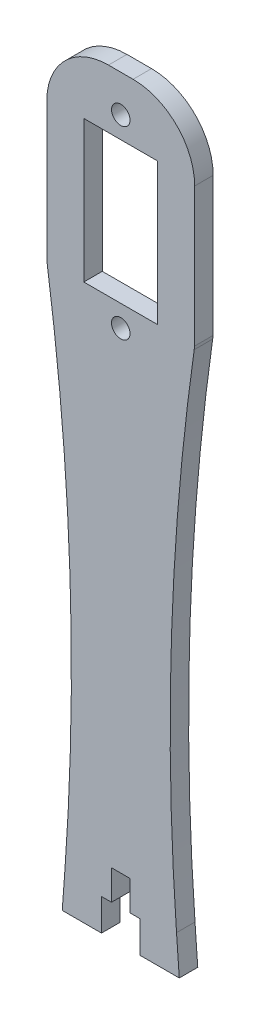
ISO-10303-21;
HEADER;
FILE_DESCRIPTION(('STEP AP214'),'2;1');
FILE_NAME('part.step','',(''),(''),'','','');
FILE_SCHEMA(('AUTOMOTIVE_DESIGN { 1 0 10303 214 1 1 1 1 }'));
ENDSEC;
DATA;
#1=APPLICATION_CONTEXT('core data for automotive mechanical design processes');
#2=APPLICATION_PROTOCOL_DEFINITION('international standard','automotive_design',2000,#1);
#3=PRODUCT_CONTEXT('',#1,'mechanical');
#4=PRODUCT('Part','Part','',(#3));
#5=PRODUCT_RELATED_PRODUCT_CATEGORY('part','',(#4));
#6=PRODUCT_DEFINITION_FORMATION('','',#4);
#7=PRODUCT_DEFINITION_CONTEXT('part definition',#1,'design');
#8=PRODUCT_DEFINITION('design','',#6,#7);
#9=PRODUCT_DEFINITION_SHAPE('','',#8);
#10=(LENGTH_UNIT() NAMED_UNIT(*) SI_UNIT(.MILLI.,.METRE.));
#11=(NAMED_UNIT(*) PLANE_ANGLE_UNIT() SI_UNIT($,.RADIAN.));
#12=(NAMED_UNIT(*) SI_UNIT($,.STERADIAN.) SOLID_ANGLE_UNIT());
#13=UNCERTAINTY_MEASURE_WITH_UNIT(LENGTH_MEASURE(1.E-05),#10,'distance_accuracy_value','');
#14=(GEOMETRIC_REPRESENTATION_CONTEXT(3) GLOBAL_UNCERTAINTY_ASSIGNED_CONTEXT((#13)) GLOBAL_UNIT_ASSIGNED_CONTEXT((#10,
#11,#12)) REPRESENTATION_CONTEXT('',''));
#15=CARTESIAN_POINT('',(0.,0.,0.));
#16=DIRECTION('',(0.,0.,1.));
#17=DIRECTION('',(1.,0.,0.));
#18=AXIS2_PLACEMENT_3D('',#15,#16,#17);
#19=CARTESIAN_POINT('',(-398.018777082135,-90.5861853265082,3.));
#20=DIRECTION('',(0.,0.,1.));
#21=DIRECTION('',(1.,0.,0.));
#22=AXIS2_PLACEMENT_3D('',#19,#20,#21);
#23=PLANE('',#22);
#24=CARTESIAN_POINT('',(0.,-8.49999999999963,3.));
#25=DIRECTION('',(0.,0.,1.));
#26=DIRECTION('',(-1.,0.,0.));
#27=AXIS2_PLACEMENT_3D('',#24,#25,#26);
#28=CIRCLE('',#27,1.50000000000003);
#29=CARTESIAN_POINT('',(-1.49999999999993,-8.49999999999963,3.));
#30=VERTEX_POINT('',#29);
#31=EDGE_CURVE('E237',#30,#30,#28,.T.);
#32=ORIENTED_EDGE('',*,*,#31,.F.);
#33=EDGE_LOOP('',(#32));
#34=FACE_BOUND('',#33,.T.);
#35=DIRECTION('',(1.,0.,0.));
#36=VECTOR('',#35,1.);
#37=CARTESIAN_POINT('',(9.49999999996186,-125.100000000001,3.));
#38=LINE('',#37,#36);
#39=CARTESIAN_POINT('',(3.12499999999931,-125.100000000001,3.));
#40=VERTEX_POINT('',#39);
#41=CARTESIAN_POINT('',(9.49999999996186,-125.100000000001,3.));
#42=VERTEX_POINT('',#41);
#43=EDGE_CURVE('E243',#40,#42,#38,.T.);
#44=ORIENTED_EDGE('',*,*,#43,.T.);
#45=DIRECTION('',(-0.0727235930969796,0.997352133906107,0.));
#46=VECTOR('',#45,1.);
#47=CARTESIAN_POINT('',(9.49999999996186,-125.100000000001,3.));
#48=LINE('',#47,#46);
#49=CARTESIAN_POINT('',(9.05144485887893,-118.948386636549,3.));
#50=VERTEX_POINT('',#49);
#51=EDGE_CURVE('E246',#42,#50,#48,.T.);
#52=ORIENTED_EDGE('',*,*,#51,.T.);
#53=CARTESIAN_POINT('',(398.01877708226,-90.586185328721,3.));
#54=DIRECTION('',(0.,0.,-1.));
#55=DIRECTION('',(-1.,0.,0.));
#56=AXIS2_PLACEMENT_3D('',#53,#54,#55);
#57=CIRCLE('',#56,390.);
#58=CARTESIAN_POINT('',(11.9201538813167,-35.5602536025256,3.));
#59=VERTEX_POINT('',#58);
#60=EDGE_CURVE('E249',#50,#59,#57,.T.);
#61=ORIENTED_EDGE('',*,*,#60,.T.);
#62=DIRECTION('',(0.141092132605903,0.989996469749624,0.));
#63=VECTOR('',#62,1.);
#64=CARTESIAN_POINT('',(11.9999999999611,-34.9999999999952,3.));
#65=LINE('',#64,#63);
#66=CARTESIAN_POINT('',(11.9999999999611,-34.9999999999952,3.));
#67=VERTEX_POINT('',#66);
#68=EDGE_CURVE('E251',#59,#67,#65,.T.);
#69=ORIENTED_EDGE('',*,*,#68,.T.);
#70=DIRECTION('',(6.48478184731022E-13,1.,0.));
#71=VECTOR('',#70,1.);
#72=CARTESIAN_POINT('',(11.9999999999611,-34.9999999999952,3.));
#73=LINE('',#72,#71);
#74=CARTESIAN_POINT('',(11.9999999999757,-12.5000000000061,3.));
#75=VERTEX_POINT('',#74);
#76=EDGE_CURVE('E253',#67,#75,#73,.T.);
#77=ORIENTED_EDGE('',*,*,#76,.T.);
#78=CARTESIAN_POINT('',(1.99999999997573,-12.4999999999996,3.));
#79=DIRECTION('',(0.,0.,1.));
#80=DIRECTION('',(1.,0.,0.));
#81=AXIS2_PLACEMENT_3D('',#78,#79,#80);
#82=CIRCLE('',#81,9.99999999999997);
#83=CARTESIAN_POINT('',(1.99999999997566,-2.4999999999996,3.));
#84=VERTEX_POINT('',#83);
#85=EDGE_CURVE('E255',#75,#84,#82,.T.);
#86=ORIENTED_EDGE('',*,*,#85,.T.);
#87=DIRECTION('',(-1.,0.,0.));
#88=VECTOR('',#87,1.);
#89=CARTESIAN_POINT('',(0.,-2.4999999999996,3.));
#90=LINE('',#89,#88);
#91=CARTESIAN_POINT('',(-2.00000000000433,-2.4999999999996,3.));
#92=VERTEX_POINT('',#91);
#93=EDGE_CURVE('E257',#84,#92,#90,.T.);
#94=ORIENTED_EDGE('',*,*,#93,.T.);
#95=CARTESIAN_POINT('',(-2.0000000000044,-12.4999999999996,3.));
#96=DIRECTION('',(0.,0.,1.));
#97=DIRECTION('',(-1.,0.,0.));
#98=AXIS2_PLACEMENT_3D('',#95,#96,#97);
#99=CIRCLE('',#98,9.99999999999997);
#100=CARTESIAN_POINT('',(-12.0000000000044,-12.5000000000015,3.));
#101=VERTEX_POINT('',#100);
#102=EDGE_CURVE('E259',#92,#101,#99,.T.);
#103=ORIENTED_EDGE('',*,*,#102,.T.);
#104=DIRECTION('',(1.88506617722831E-13,-1.,0.));
#105=VECTOR('',#104,1.);
#106=CARTESIAN_POINT('',(-12.0000000000001,-34.9999999999993,3.));
#107=LINE('',#106,#105);
#108=CARTESIAN_POINT('',(-12.0000000000001,-34.9999999999993,3.));
#109=VERTEX_POINT('',#108);
#110=EDGE_CURVE('E261',#101,#109,#107,.T.);
#111=ORIENTED_EDGE('',*,*,#110,.T.);
#112=DIRECTION('',(0.141092133438911,-0.989996469630905,0.));
#113=VECTOR('',#112,1.);
#114=CARTESIAN_POINT('',(-12.0000000000001,-34.9999999999993,3.));
#115=LINE('',#114,#113);
#116=CARTESIAN_POINT('',(-11.9201539260924,-35.5602532852561,3.));
#117=VERTEX_POINT('',#116);
#118=EDGE_CURVE('E263',#109,#117,#115,.T.);
#119=ORIENTED_EDGE('',*,*,#118,.T.);
#120=CARTESIAN_POINT('',(-398.018777082135,-90.5861853265082,3.));
#121=DIRECTION('',(0.,0.,-1.));
#122=DIRECTION('',(1.,0.,0.));
#123=AXIS2_PLACEMENT_3D('',#120,#121,#122);
#124=CIRCLE('',#123,390.000000000001);
#125=CARTESIAN_POINT('',(-9.05144485876297,-118.948386634463,3.));
#126=VERTEX_POINT('',#125);
#127=EDGE_CURVE('E265',#117,#126,#124,.T.);
#128=ORIENTED_EDGE('',*,*,#127,.T.);
#129=DIRECTION('',(-0.0727235930973346,-0.997352133906081,0.));
#130=VECTOR('',#129,1.);
#131=CARTESIAN_POINT('',(-9.50000000000011,-125.1,3.));
#132=LINE('',#131,#130);
#133=CARTESIAN_POINT('',(-9.50000000000011,-125.1,3.));
#134=VERTEX_POINT('',#133);
#135=EDGE_CURVE('E267',#126,#134,#132,.T.);
#136=ORIENTED_EDGE('',*,*,#135,.T.);
#137=DIRECTION('',(1.,-1.21906841919636E-13,0.));
#138=VECTOR('',#137,1.);
#139=CARTESIAN_POINT('',(-3.12500000000069,-125.100000000001,3.));
#140=LINE('',#139,#138);
#141=CARTESIAN_POINT('',(-3.12500000000069,-125.100000000001,3.));
#142=VERTEX_POINT('',#141);
#143=EDGE_CURVE('E269',#134,#142,#140,.T.);
#144=ORIENTED_EDGE('',*,*,#143,.T.);
#145=DIRECTION('',(0.,1.,0.));
#146=VECTOR('',#145,1.);
#147=CARTESIAN_POINT('',(-3.12500000000069,-119.95,3.));
#148=LINE('',#147,#146);
#149=CARTESIAN_POINT('',(-3.12500000000069,-119.95,3.));
#150=VERTEX_POINT('',#149);
#151=EDGE_CURVE('E271',#142,#150,#148,.T.);
#152=ORIENTED_EDGE('',*,*,#151,.T.);
#153=DIRECTION('',(1.,0.,0.));
#154=VECTOR('',#153,1.);
#155=CARTESIAN_POINT('',(-1.50000000003821,-119.95,3.));
#156=LINE('',#155,#154);
#157=CARTESIAN_POINT('',(-1.50000000003821,-119.95,3.));
#158=VERTEX_POINT('',#157);
#159=EDGE_CURVE('E273',#150,#158,#156,.T.);
#160=ORIENTED_EDGE('',*,*,#159,.T.);
#161=DIRECTION('',(0.,1.,0.));
#162=VECTOR('',#161,1.);
#163=CARTESIAN_POINT('',(-1.50000000003821,-119.95,3.));
#164=LINE('',#163,#162);
#165=CARTESIAN_POINT('',(-1.50000000003821,-115.099999999995,3.));
#166=VERTEX_POINT('',#165);
#167=EDGE_CURVE('E275',#158,#166,#164,.T.);
#168=ORIENTED_EDGE('',*,*,#167,.T.);
#169=DIRECTION('',(1.,0.,0.));
#170=VECTOR('',#169,1.);
#171=CARTESIAN_POINT('',(-1.50000000003821,-115.099999999995,3.));
#172=LINE('',#171,#170);
#173=CARTESIAN_POINT('',(1.49999999996179,-115.099999999995,3.));
#174=VERTEX_POINT('',#173);
#175=EDGE_CURVE('E277',#166,#174,#172,.T.);
#176=ORIENTED_EDGE('',*,*,#175,.T.);
#177=DIRECTION('',(0.,-1.,0.));
#178=VECTOR('',#177,1.);
#179=CARTESIAN_POINT('',(1.49999999996179,-115.099999999995,3.));
#180=LINE('',#179,#178);
#181=CARTESIAN_POINT('',(1.49999999996179,-119.95,3.));
#182=VERTEX_POINT('',#181);
#183=EDGE_CURVE('E279',#174,#182,#180,.T.);
#184=ORIENTED_EDGE('',*,*,#183,.T.);
#185=DIRECTION('',(1.,0.,0.));
#186=VECTOR('',#185,1.);
#187=CARTESIAN_POINT('',(3.12499999999931,-119.95,3.));
#188=LINE('',#187,#186);
#189=CARTESIAN_POINT('',(3.12499999999931,-119.95,3.));
#190=VERTEX_POINT('',#189);
#191=EDGE_CURVE('E281',#182,#190,#188,.T.);
#192=ORIENTED_EDGE('',*,*,#191,.T.);
#193=DIRECTION('',(0.,-1.,0.));
#194=VECTOR('',#193,1.);
#195=CARTESIAN_POINT('',(3.12499999999931,-119.95,3.));
#196=LINE('',#195,#194);
#197=EDGE_CURVE('E283',#190,#40,#196,.T.);
#198=ORIENTED_EDGE('',*,*,#197,.T.);
#199=EDGE_LOOP('',(#44,#52,#61,#69,#77,#86,#94,#103,#111,#119,#128,#136,#144,#152,#160,#168,
#176,#184,#192,#198));
#200=FACE_BOUND('',#199,.T.);
#201=CARTESIAN_POINT('',(-6.93889390390723E-13,-38.4998710234909,3.));
#202=DIRECTION('',(0.,0.,1.));
#203=DIRECTION('',(-1.,0.,0.));
#204=AXIS2_PLACEMENT_3D('',#201,#202,#203);
#205=CIRCLE('',#204,1.50000000000001);
#206=CARTESIAN_POINT('',(-1.50000000000071,-38.4998710234909,3.));
#207=VERTEX_POINT('',#206);
#208=EDGE_CURVE('E231',#207,#207,#205,.T.);
#209=ORIENTED_EDGE('',*,*,#208,.F.);
#210=EDGE_LOOP('',(#209));
#211=FACE_BOUND('',#210,.T.);
#212=DIRECTION('',(0.,1.,0.));
#213=VECTOR('',#212,1.);
#214=CARTESIAN_POINT('',(5.99999999999739,-34.9999999999995,3.));
#215=LINE('',#214,#213);
#216=CARTESIAN_POINT('',(5.99999999999739,-34.9999999999995,3.));
#217=VERTEX_POINT('',#216);
#218=CARTESIAN_POINT('',(5.99999999999739,-11.9999999999995,3.));
#219=VERTEX_POINT('',#218);
#220=EDGE_CURVE('E213',#217,#219,#215,.T.);
#221=ORIENTED_EDGE('',*,*,#220,.F.);
#222=DIRECTION('',(1.,0.,0.));
#223=VECTOR('',#222,1.);
#224=CARTESIAN_POINT('',(-5.99999999999739,-34.9999999999995,3.));
#225=LINE('',#224,#223);
#226=CARTESIAN_POINT('',(-5.99999999999739,-34.9999999999995,3.));
#227=VERTEX_POINT('',#226);
#228=EDGE_CURVE('E200',#227,#217,#225,.T.);
#229=ORIENTED_EDGE('',*,*,#228,.F.);
#230=DIRECTION('',(0.,-1.,0.));
#231=VECTOR('',#230,1.);
#232=CARTESIAN_POINT('',(-5.99999999999739,-23.4999999999995,3.));
#233=LINE('',#232,#231);
#234=CARTESIAN_POINT('',(-5.99999999999743,-11.9999999999995,3.));
#235=VERTEX_POINT('',#234);
#236=EDGE_CURVE('E195',#235,#227,#233,.T.);
#237=ORIENTED_EDGE('',*,*,#236,.F.);
#238=DIRECTION('',(-1.,0.,0.));
#239=VECTOR('',#238,1.);
#240=CARTESIAN_POINT('',(5.99999999999739,-11.9999999999995,3.));
#241=LINE('',#240,#239);
#242=EDGE_CURVE('E215',#219,#235,#241,.T.);
#243=ORIENTED_EDGE('',*,*,#242,.F.);
#244=EDGE_LOOP('',(#221,#229,#237,#243));
#245=FACE_BOUND('',#244,.T.);
#246=ADVANCED_FACE('F37',(#34,#200,#211,#245),#23,.T.);
#247=CARTESIAN_POINT('',(-398.018777082135,-90.5861853265082,0.));
#248=DIRECTION('',(0.,0.,1.));
#249=DIRECTION('',(1.,0.,0.));
#250=AXIS2_PLACEMENT_3D('',#247,#248,#249);
#251=PLANE('',#250);
#252=CARTESIAN_POINT('',(-6.93889390390723E-13,-38.4998710234909,0.));
#253=DIRECTION('',(0.,0.,1.));
#254=DIRECTION('',(-1.,0.,0.));
#255=AXIS2_PLACEMENT_3D('',#252,#253,#254);
#256=CIRCLE('',#255,1.50000000000001);
#257=CARTESIAN_POINT('',(-1.50000000000071,-38.4998710234909,0.));
#258=VERTEX_POINT('',#257);
#259=EDGE_CURVE('E209',#258,#258,#256,.T.);
#260=ORIENTED_EDGE('',*,*,#259,.T.);
#261=EDGE_LOOP('',(#260));
#262=FACE_BOUND('',#261,.T.);
#263=CARTESIAN_POINT('',(0.,-8.49999999999963,0.));
#264=DIRECTION('',(0.,0.,1.));
#265=DIRECTION('',(-1.,0.,0.));
#266=AXIS2_PLACEMENT_3D('',#263,#264,#265);
#267=CIRCLE('',#266,1.50000000000003);
#268=CARTESIAN_POINT('',(-1.49999999999993,-8.49999999999963,0.));
#269=VERTEX_POINT('',#268);
#270=EDGE_CURVE('E234',#269,#269,#267,.T.);
#271=ORIENTED_EDGE('',*,*,#270,.T.);
#272=EDGE_LOOP('',(#271));
#273=FACE_BOUND('',#272,.T.);
#274=DIRECTION('',(1.,0.,0.));
#275=VECTOR('',#274,1.);
#276=CARTESIAN_POINT('',(9.49999999996186,-125.100000000001,0.));
#277=LINE('',#276,#275);
#278=CARTESIAN_POINT('',(3.12499999999931,-125.100000000001,0.));
#279=VERTEX_POINT('',#278);
#280=CARTESIAN_POINT('',(9.49999999996186,-125.100000000001,0.));
#281=VERTEX_POINT('',#280);
#282=EDGE_CURVE('E240',#279,#281,#277,.T.);
#283=ORIENTED_EDGE('',*,*,#282,.F.);
#284=DIRECTION('',(0.,-1.,0.));
#285=VECTOR('',#284,1.);
#286=CARTESIAN_POINT('',(3.12499999999931,-119.95,0.));
#287=LINE('',#286,#285);
#288=CARTESIAN_POINT('',(3.12499999999931,-119.95,0.));
#289=VERTEX_POINT('',#288);
#290=EDGE_CURVE('E247',#289,#279,#287,.T.);
#291=ORIENTED_EDGE('',*,*,#290,.F.);
#292=DIRECTION('',(1.,0.,0.));
#293=VECTOR('',#292,1.);
#294=CARTESIAN_POINT('',(3.12499999999931,-119.95,0.));
#295=LINE('',#294,#293);
#296=CARTESIAN_POINT('',(1.49999999996179,-119.95,0.));
#297=VERTEX_POINT('',#296);
#298=EDGE_CURVE('E323',#297,#289,#295,.T.);
#299=ORIENTED_EDGE('',*,*,#298,.F.);
#300=DIRECTION('',(0.,-1.,0.));
#301=VECTOR('',#300,1.);
#302=CARTESIAN_POINT('',(1.49999999996179,-115.099999999995,0.));
#303=LINE('',#302,#301);
#304=CARTESIAN_POINT('',(1.49999999996179,-115.099999999995,0.));
#305=VERTEX_POINT('',#304);
#306=EDGE_CURVE('E321',#305,#297,#303,.T.);
#307=ORIENTED_EDGE('',*,*,#306,.F.);
#308=DIRECTION('',(1.,0.,0.));
#309=VECTOR('',#308,1.);
#310=CARTESIAN_POINT('',(-1.50000000003821,-115.099999999995,0.));
#311=LINE('',#310,#309);
#312=CARTESIAN_POINT('',(-1.50000000003821,-115.099999999995,0.));
#313=VERTEX_POINT('',#312);
#314=EDGE_CURVE('E319',#313,#305,#311,.T.);
#315=ORIENTED_EDGE('',*,*,#314,.F.);
#316=DIRECTION('',(0.,1.,0.));
#317=VECTOR('',#316,1.);
#318=CARTESIAN_POINT('',(-1.50000000003821,-119.95,0.));
#319=LINE('',#318,#317);
#320=CARTESIAN_POINT('',(-1.50000000003821,-119.95,0.));
#321=VERTEX_POINT('',#320);
#322=EDGE_CURVE('E317',#321,#313,#319,.T.);
#323=ORIENTED_EDGE('',*,*,#322,.F.);
#324=DIRECTION('',(1.,0.,0.));
#325=VECTOR('',#324,1.);
#326=CARTESIAN_POINT('',(-1.50000000003821,-119.95,0.));
#327=LINE('',#326,#325);
#328=CARTESIAN_POINT('',(-3.12500000000069,-119.95,0.));
#329=VERTEX_POINT('',#328);
#330=EDGE_CURVE('E315',#329,#321,#327,.T.);
#331=ORIENTED_EDGE('',*,*,#330,.F.);
#332=DIRECTION('',(0.,1.,0.));
#333=VECTOR('',#332,1.);
#334=CARTESIAN_POINT('',(-3.12500000000069,-119.95,0.));
#335=LINE('',#334,#333);
#336=CARTESIAN_POINT('',(-3.12500000000069,-125.100000000001,0.));
#337=VERTEX_POINT('',#336);
#338=EDGE_CURVE('E313',#337,#329,#335,.T.);
#339=ORIENTED_EDGE('',*,*,#338,.F.);
#340=DIRECTION('',(1.,-1.21906841919636E-13,0.));
#341=VECTOR('',#340,1.);
#342=CARTESIAN_POINT('',(-3.12500000000069,-125.100000000001,0.));
#343=LINE('',#342,#341);
#344=CARTESIAN_POINT('',(-9.50000000000011,-125.1,0.));
#345=VERTEX_POINT('',#344);
#346=EDGE_CURVE('E311',#345,#337,#343,.T.);
#347=ORIENTED_EDGE('',*,*,#346,.F.);
#348=DIRECTION('',(-0.0727235930973346,-0.997352133906081,0.));
#349=VECTOR('',#348,1.);
#350=CARTESIAN_POINT('',(-9.50000000000011,-125.1,0.));
#351=LINE('',#350,#349);
#352=CARTESIAN_POINT('',(-9.05144485876297,-118.948386634463,0.));
#353=VERTEX_POINT('',#352);
#354=EDGE_CURVE('E309',#353,#345,#351,.T.);
#355=ORIENTED_EDGE('',*,*,#354,.F.);
#356=CARTESIAN_POINT('',(-398.018777082135,-90.5861853265082,0.));
#357=DIRECTION('',(0.,0.,-1.));
#358=DIRECTION('',(1.,0.,0.));
#359=AXIS2_PLACEMENT_3D('',#356,#357,#358);
#360=CIRCLE('',#359,390.000000000001);
#361=CARTESIAN_POINT('',(-11.9201539260924,-35.5602532852561,0.));
#362=VERTEX_POINT('',#361);
#363=EDGE_CURVE('E307',#362,#353,#360,.T.);
#364=ORIENTED_EDGE('',*,*,#363,.F.);
#365=DIRECTION('',(0.141092133438911,-0.989996469630905,0.));
#366=VECTOR('',#365,1.);
#367=CARTESIAN_POINT('',(-12.0000000000001,-34.9999999999993,0.));
#368=LINE('',#367,#366);
#369=CARTESIAN_POINT('',(-12.0000000000001,-34.9999999999993,0.));
#370=VERTEX_POINT('',#369);
#371=EDGE_CURVE('E305',#370,#362,#368,.T.);
#372=ORIENTED_EDGE('',*,*,#371,.F.);
#373=DIRECTION('',(1.88506617722831E-13,-1.,0.));
#374=VECTOR('',#373,1.);
#375=CARTESIAN_POINT('',(-12.0000000000001,-34.9999999999993,0.));
#376=LINE('',#375,#374);
#377=CARTESIAN_POINT('',(-12.0000000000044,-12.5000000000015,0.));
#378=VERTEX_POINT('',#377);
#379=EDGE_CURVE('E303',#378,#370,#376,.T.);
#380=ORIENTED_EDGE('',*,*,#379,.F.);
#381=CARTESIAN_POINT('',(-2.0000000000044,-12.4999999999996,0.));
#382=DIRECTION('',(0.,0.,1.));
#383=DIRECTION('',(-1.,0.,0.));
#384=AXIS2_PLACEMENT_3D('',#381,#382,#383);
#385=CIRCLE('',#384,9.99999999999997);
#386=CARTESIAN_POINT('',(-2.00000000000433,-2.4999999999996,0.));
#387=VERTEX_POINT('',#386);
#388=EDGE_CURVE('E301',#387,#378,#385,.T.);
#389=ORIENTED_EDGE('',*,*,#388,.F.);
#390=DIRECTION('',(-1.,0.,0.));
#391=VECTOR('',#390,1.);
#392=CARTESIAN_POINT('',(-2.00000000000434,-2.4999999999996,0.));
#393=LINE('',#392,#391);
#394=CARTESIAN_POINT('',(1.99999999997566,-2.4999999999996,0.));
#395=VERTEX_POINT('',#394);
#396=EDGE_CURVE('E299',#395,#387,#393,.T.);
#397=ORIENTED_EDGE('',*,*,#396,.F.);
#398=CARTESIAN_POINT('',(1.99999999997573,-12.4999999999996,0.));
#399=DIRECTION('',(0.,0.,1.));
#400=DIRECTION('',(1.,0.,0.));
#401=AXIS2_PLACEMENT_3D('',#398,#399,#400);
#402=CIRCLE('',#401,9.99999999999997);
#403=CARTESIAN_POINT('',(11.9999999999757,-12.5000000000061,0.));
#404=VERTEX_POINT('',#403);
#405=EDGE_CURVE('E296',#404,#395,#402,.T.);
#406=ORIENTED_EDGE('',*,*,#405,.F.);
#407=DIRECTION('',(6.48478184731022E-13,1.,0.));
#408=VECTOR('',#407,1.);
#409=CARTESIAN_POINT('',(11.9999999999611,-34.9999999999952,0.));
#410=LINE('',#409,#408);
#411=CARTESIAN_POINT('',(11.9999999999611,-34.9999999999952,0.));
#412=VERTEX_POINT('',#411);
#413=EDGE_CURVE('E294',#412,#404,#410,.T.);
#414=ORIENTED_EDGE('',*,*,#413,.F.);
#415=DIRECTION('',(0.141092132605903,0.989996469749624,0.));
#416=VECTOR('',#415,1.);
#417=CARTESIAN_POINT('',(11.9999999999611,-34.9999999999952,0.));
#418=LINE('',#417,#416);
#419=CARTESIAN_POINT('',(11.9201538813167,-35.5602536025256,0.));
#420=VERTEX_POINT('',#419);
#421=EDGE_CURVE('E292',#420,#412,#418,.T.);
#422=ORIENTED_EDGE('',*,*,#421,.F.);
#423=CARTESIAN_POINT('',(398.01877708226,-90.586185328721,0.));
#424=DIRECTION('',(0.,0.,-1.));
#425=DIRECTION('',(-1.,0.,0.));
#426=AXIS2_PLACEMENT_3D('',#423,#424,#425);
#427=CIRCLE('',#426,390.);
#428=CARTESIAN_POINT('',(9.05144485887893,-118.948386636549,0.));
#429=VERTEX_POINT('',#428);
#430=EDGE_CURVE('E290',#429,#420,#427,.T.);
#431=ORIENTED_EDGE('',*,*,#430,.F.);
#432=DIRECTION('',(-0.0727235930969796,0.997352133906107,0.));
#433=VECTOR('',#432,1.);
#434=CARTESIAN_POINT('',(9.49999999996186,-125.100000000001,0.));
#435=LINE('',#434,#433);
#436=EDGE_CURVE('E288',#281,#429,#435,.T.);
#437=ORIENTED_EDGE('',*,*,#436,.F.);
#438=EDGE_LOOP('',(#283,#291,#299,#307,#315,#323,#331,#339,#347,#355,#364,#372,#380,#389,#397,
#406,#414,#422,#431,#437));
#439=FACE_BOUND('',#438,.T.);
#440=DIRECTION('',(1.,0.,0.));
#441=VECTOR('',#440,1.);
#442=CARTESIAN_POINT('',(5.99999999999739,-34.9999999999995,0.));
#443=LINE('',#442,#441);
#444=CARTESIAN_POINT('',(-5.99999999999742,-34.9999999999995,0.));
#445=VERTEX_POINT('',#444);
#446=CARTESIAN_POINT('',(5.99999999999739,-34.9999999999995,0.));
#447=VERTEX_POINT('',#446);
#448=EDGE_CURVE('E207',#445,#447,#443,.T.);
#449=ORIENTED_EDGE('',*,*,#448,.T.);
#450=DIRECTION('',(0.,1.,0.));
#451=VECTOR('',#450,1.);
#452=CARTESIAN_POINT('',(5.99999999999739,-34.9999999999995,0.));
#453=LINE('',#452,#451);
#454=CARTESIAN_POINT('',(5.99999999999739,-11.9999999999995,0.));
#455=VERTEX_POINT('',#454);
#456=EDGE_CURVE('E220',#447,#455,#453,.T.);
#457=ORIENTED_EDGE('',*,*,#456,.T.);
#458=DIRECTION('',(-1.,0.,0.));
#459=VECTOR('',#458,1.);
#460=CARTESIAN_POINT('',(5.99999999999739,-11.9999999999995,0.));
#461=LINE('',#460,#459);
#462=CARTESIAN_POINT('',(-5.9999999999974,-11.9999999999995,0.));
#463=VERTEX_POINT('',#462);
#464=EDGE_CURVE('E223',#455,#463,#461,.T.);
#465=ORIENTED_EDGE('',*,*,#464,.T.);
#466=DIRECTION('',(0.,-1.,0.));
#467=VECTOR('',#466,1.);
#468=CARTESIAN_POINT('',(-5.99999999999739,-23.4999999999995,0.));
#469=LINE('',#468,#467);
#470=EDGE_CURVE('E201',#463,#445,#469,.T.);
#471=ORIENTED_EDGE('',*,*,#470,.T.);
#472=EDGE_LOOP('',(#449,#457,#465,#471));
#473=FACE_BOUND('',#472,.T.);
#474=ADVANCED_FACE('F389',(#262,#273,#439,#473),#251,.F.);
#475=CARTESIAN_POINT('',(9.49999999996186,-125.100000000001,3.));
#476=DIRECTION('',(0.,1.,0.));
#477=DIRECTION('',(0.,0.,1.));
#478=AXIS2_PLACEMENT_3D('',#475,#476,#477);
#479=PLANE('',#478);
#480=ORIENTED_EDGE('',*,*,#282,.T.);
#481=DIRECTION('',(0.,0.,-1.));
#482=VECTOR('',#481,1.);
#483=CARTESIAN_POINT('',(9.49999999996186,-125.100000000001,3.));
#484=LINE('',#483,#482);
#485=EDGE_CURVE('E11',#42,#281,#484,.T.);
#486=ORIENTED_EDGE('',*,*,#485,.F.);
#487=ORIENTED_EDGE('',*,*,#43,.F.);
#488=DIRECTION('',(0.,0.,-1.));
#489=VECTOR('',#488,1.);
#490=CARTESIAN_POINT('',(3.12499999999931,-125.100000000001,3.));
#491=LINE('',#490,#489);
#492=EDGE_CURVE('E285',#40,#279,#491,.T.);
#493=ORIENTED_EDGE('',*,*,#492,.T.);
#494=EDGE_LOOP('',(#480,#486,#487,#493));
#495=FACE_BOUND('',#494,.T.);
#496=ADVANCED_FACE('F39',(#495),#479,.F.);
#497=CARTESIAN_POINT('',(9.49999999996186,-125.100000000001,3.));
#498=DIRECTION('',(-0.997352133906107,-0.0727235930969796,0.));
#499=DIRECTION('',(0.0727235930969796,-0.997352133906107,0.));
#500=AXIS2_PLACEMENT_3D('',#497,#498,#499);
#501=PLANE('',#500);
#502=ORIENTED_EDGE('',*,*,#436,.T.);
#503=DIRECTION('',(0.,0.,-1.));
#504=VECTOR('',#503,1.);
#505=CARTESIAN_POINT('',(9.05144485887893,-118.948386636549,3.));
#506=LINE('',#505,#504);
#507=EDGE_CURVE('E45',#50,#429,#506,.T.);
#508=ORIENTED_EDGE('',*,*,#507,.F.);
#509=ORIENTED_EDGE('',*,*,#51,.F.);
#510=ORIENTED_EDGE('',*,*,#485,.T.);
#511=EDGE_LOOP('',(#502,#508,#509,#510));
#512=FACE_BOUND('',#511,.T.);
#513=ADVANCED_FACE('F407',(#512),#501,.F.);
#514=CARTESIAN_POINT('',(398.01877708226,-90.586185328721,3.));
#515=DIRECTION('',(0.,0.,-1.));
#516=DIRECTION('',(-1.,0.,0.));
#517=AXIS2_PLACEMENT_3D('',#514,#515,#516);
#518=CYLINDRICAL_SURFACE('',#517,390.);
#519=ORIENTED_EDGE('',*,*,#430,.T.);
#520=DIRECTION('',(0.,0.,-1.));
#521=VECTOR('',#520,1.);
#522=CARTESIAN_POINT('',(11.9201538813167,-35.5602536025256,3.));
#523=LINE('',#522,#521);
#524=EDGE_CURVE('E376',#59,#420,#523,.T.);
#525=ORIENTED_EDGE('',*,*,#524,.F.);
#526=ORIENTED_EDGE('',*,*,#60,.F.);
#527=ORIENTED_EDGE('',*,*,#507,.T.);
#528=EDGE_LOOP('',(#519,#525,#526,#527));
#529=FACE_BOUND('',#528,.T.);
#530=ADVANCED_FACE('F383',(#529),#518,.F.);
#531=CARTESIAN_POINT('',(11.9999999999611,-34.9999999999952,3.));
#532=DIRECTION('',(-0.989996469749624,0.141092132605903,0.));
#533=DIRECTION('',(-0.141092132605903,-0.989996469749624,0.));
#534=AXIS2_PLACEMENT_3D('',#531,#532,#533);
#535=PLANE('',#534);
#536=ORIENTED_EDGE('',*,*,#421,.T.);
#537=DIRECTION('',(0.,0.,-1.));
#538=VECTOR('',#537,1.);
#539=CARTESIAN_POINT('',(11.9999999999611,-34.9999999999952,3.));
#540=LINE('',#539,#538);
#541=EDGE_CURVE('E373',#67,#412,#540,.T.);
#542=ORIENTED_EDGE('',*,*,#541,.F.);
#543=ORIENTED_EDGE('',*,*,#68,.F.);
#544=ORIENTED_EDGE('',*,*,#524,.T.);
#545=EDGE_LOOP('',(#536,#542,#543,#544));
#546=FACE_BOUND('',#545,.T.);
#547=ADVANCED_FACE('F395',(#546),#535,.F.);
#548=CARTESIAN_POINT('',(11.9999999999611,-34.9999999999952,3.));
#549=DIRECTION('',(-1.,6.48478184731022E-13,0.));
#550=DIRECTION('',(-6.48478184731022E-13,-1.,0.));
#551=AXIS2_PLACEMENT_3D('',#548,#549,#550);
#552=PLANE('',#551);
#553=ORIENTED_EDGE('',*,*,#413,.T.);
#554=DIRECTION('',(0.,0.,-1.));
#555=VECTOR('',#554,1.);
#556=CARTESIAN_POINT('',(11.9999999999757,-12.5000000000061,3.));
#557=LINE('',#556,#555);
#558=EDGE_CURVE('E370',#75,#404,#557,.T.);
#559=ORIENTED_EDGE('',*,*,#558,.F.);
#560=ORIENTED_EDGE('',*,*,#76,.F.);
#561=ORIENTED_EDGE('',*,*,#541,.T.);
#562=EDGE_LOOP('',(#553,#559,#560,#561));
#563=FACE_BOUND('',#562,.T.);
#564=ADVANCED_FACE('F399',(#563),#552,.F.);
#565=CARTESIAN_POINT('',(1.99999999997573,-12.4999999999996,3.));
#566=DIRECTION('',(0.,0.,-1.));
#567=DIRECTION('',(-1.,0.,0.));
#568=AXIS2_PLACEMENT_3D('',#565,#566,#567);
#569=CYLINDRICAL_SURFACE('',#568,9.99999999999997);
#570=ORIENTED_EDGE('',*,*,#405,.T.);
#571=DIRECTION('',(0.,0.,-1.));
#572=VECTOR('',#571,1.);
#573=CARTESIAN_POINT('',(1.99999999997566,-2.4999999999996,3.));
#574=LINE('',#573,#572);
#575=EDGE_CURVE('E367',#84,#395,#574,.T.);
#576=ORIENTED_EDGE('',*,*,#575,.F.);
#577=ORIENTED_EDGE('',*,*,#85,.F.);
#578=ORIENTED_EDGE('',*,*,#558,.T.);
#579=EDGE_LOOP('',(#570,#576,#577,#578));
#580=FACE_BOUND('',#579,.T.);
#581=ADVANCED_FACE('F479',(#580),#569,.T.);
#582=CARTESIAN_POINT('',(-2.00000000000434,-2.4999999999996,3.));
#583=DIRECTION('',(0.,-1.,0.));
#584=DIRECTION('',(1.,0.,0.));
#585=AXIS2_PLACEMENT_3D('',#582,#583,#584);
#586=PLANE('',#585);
#587=ORIENTED_EDGE('',*,*,#396,.T.);
#588=DIRECTION('',(0.,0.,-1.));
#589=VECTOR('',#588,1.);
#590=CARTESIAN_POINT('',(-2.00000000000433,-2.4999999999996,3.));
#591=LINE('',#590,#589);
#592=EDGE_CURVE('E364',#92,#387,#591,.T.);
#593=ORIENTED_EDGE('',*,*,#592,.F.);
#594=ORIENTED_EDGE('',*,*,#93,.F.);
#595=ORIENTED_EDGE('',*,*,#575,.T.);
#596=EDGE_LOOP('',(#587,#593,#594,#595));
#597=FACE_BOUND('',#596,.T.);
#598=ADVANCED_FACE('F477',(#597),#586,.F.);
#599=CARTESIAN_POINT('',(-2.0000000000044,-12.4999999999996,3.));
#600=DIRECTION('',(0.,0.,-1.));
#601=DIRECTION('',(-1.,0.,0.));
#602=AXIS2_PLACEMENT_3D('',#599,#600,#601);
#603=CYLINDRICAL_SURFACE('',#602,9.99999999999997);
#604=ORIENTED_EDGE('',*,*,#388,.T.);
#605=DIRECTION('',(0.,0.,-1.));
#606=VECTOR('',#605,1.);
#607=CARTESIAN_POINT('',(-12.0000000000044,-12.5000000000015,3.));
#608=LINE('',#607,#606);
#609=EDGE_CURVE('E361',#101,#378,#608,.T.);
#610=ORIENTED_EDGE('',*,*,#609,.F.);
#611=ORIENTED_EDGE('',*,*,#102,.F.);
#612=ORIENTED_EDGE('',*,*,#592,.T.);
#613=EDGE_LOOP('',(#604,#610,#611,#612));
#614=FACE_BOUND('',#613,.T.);
#615=ADVANCED_FACE('F472',(#614),#603,.T.);
#616=CARTESIAN_POINT('',(-12.0000000000001,-34.9999999999993,3.));
#617=DIRECTION('',(1.,1.88506617722831E-13,0.));
#618=DIRECTION('',(-1.88506617722831E-13,1.,0.));
#619=AXIS2_PLACEMENT_3D('',#616,#617,#618);
#620=PLANE('',#619);
#621=ORIENTED_EDGE('',*,*,#379,.T.);
#622=DIRECTION('',(0.,0.,-1.));
#623=VECTOR('',#622,1.);
#624=CARTESIAN_POINT('',(-12.0000000000001,-34.9999999999993,3.));
#625=LINE('',#624,#623);
#626=EDGE_CURVE('E358',#109,#370,#625,.T.);
#627=ORIENTED_EDGE('',*,*,#626,.F.);
#628=ORIENTED_EDGE('',*,*,#110,.F.);
#629=ORIENTED_EDGE('',*,*,#609,.T.);
#630=EDGE_LOOP('',(#621,#627,#628,#629));
#631=FACE_BOUND('',#630,.T.);
#632=ADVANCED_FACE('F468',(#631),#620,.F.);
#633=CARTESIAN_POINT('',(-12.0000000000001,-34.9999999999993,3.));
#634=DIRECTION('',(0.989996469630905,0.141092133438911,0.));
#635=DIRECTION('',(-0.141092133438911,0.989996469630906,0.));
#636=AXIS2_PLACEMENT_3D('',#633,#634,#635);
#637=PLANE('',#636);
#638=ORIENTED_EDGE('',*,*,#371,.T.);
#639=DIRECTION('',(0.,0.,-1.));
#640=VECTOR('',#639,1.);
#641=CARTESIAN_POINT('',(-11.9201539260924,-35.5602532852561,3.));
#642=LINE('',#641,#640);
#643=EDGE_CURVE('E355',#117,#362,#642,.T.);
#644=ORIENTED_EDGE('',*,*,#643,.F.);
#645=ORIENTED_EDGE('',*,*,#118,.F.);
#646=ORIENTED_EDGE('',*,*,#626,.T.);
#647=EDGE_LOOP('',(#638,#644,#645,#646));
#648=FACE_BOUND('',#647,.T.);
#649=ADVANCED_FACE('F464',(#648),#637,.F.);
#650=CARTESIAN_POINT('',(-398.018777082135,-90.5861853265082,3.));
#651=DIRECTION('',(0.,0.,-1.));
#652=DIRECTION('',(-1.,0.,0.));
#653=AXIS2_PLACEMENT_3D('',#650,#651,#652);
#654=CYLINDRICAL_SURFACE('',#653,390.000000000001);
#655=ORIENTED_EDGE('',*,*,#363,.T.);
#656=DIRECTION('',(0.,0.,-1.));
#657=VECTOR('',#656,1.);
#658=CARTESIAN_POINT('',(-9.05144485876297,-118.948386634463,3.));
#659=LINE('',#658,#657);
#660=EDGE_CURVE('E352',#126,#353,#659,.T.);
#661=ORIENTED_EDGE('',*,*,#660,.F.);
#662=ORIENTED_EDGE('',*,*,#127,.F.);
#663=ORIENTED_EDGE('',*,*,#643,.T.);
#664=EDGE_LOOP('',(#655,#661,#662,#663));
#665=FACE_BOUND('',#664,.T.);
#666=ADVANCED_FACE('F459',(#665),#654,.F.);
#667=CARTESIAN_POINT('',(-9.50000000000011,-125.1,3.));
#668=DIRECTION('',(0.997352133906081,-0.0727235930973346,0.));
#669=DIRECTION('',(0.0727235930973346,0.997352133906081,0.));
#670=AXIS2_PLACEMENT_3D('',#667,#668,#669);
#671=PLANE('',#670);
#672=ORIENTED_EDGE('',*,*,#354,.T.);
#673=DIRECTION('',(0.,0.,-1.));
#674=VECTOR('',#673,1.);
#675=CARTESIAN_POINT('',(-9.50000000000011,-125.1,3.));
#676=LINE('',#675,#674);
#677=EDGE_CURVE('E349',#134,#345,#676,.T.);
#678=ORIENTED_EDGE('',*,*,#677,.F.);
#679=ORIENTED_EDGE('',*,*,#135,.F.);
#680=ORIENTED_EDGE('',*,*,#660,.T.);
#681=EDGE_LOOP('',(#672,#678,#679,#680));
#682=FACE_BOUND('',#681,.T.);
#683=ADVANCED_FACE('F453',(#682),#671,.F.);
#684=CARTESIAN_POINT('',(-3.12500000000069,-125.100000000001,3.));
#685=DIRECTION('',(1.21906841919636E-13,1.,0.));
#686=DIRECTION('',(-1.,1.21906841919636E-13,0.));
#687=AXIS2_PLACEMENT_3D('',#684,#685,#686);
#688=PLANE('',#687);
#689=ORIENTED_EDGE('',*,*,#346,.T.);
#690=DIRECTION('',(0.,0.,-1.));
#691=VECTOR('',#690,1.);
#692=CARTESIAN_POINT('',(-3.12500000000069,-125.100000000001,3.));
#693=LINE('',#692,#691);
#694=EDGE_CURVE('E346',#142,#337,#693,.T.);
#695=ORIENTED_EDGE('',*,*,#694,.F.);
#696=ORIENTED_EDGE('',*,*,#143,.F.);
#697=ORIENTED_EDGE('',*,*,#677,.T.);
#698=EDGE_LOOP('',(#689,#695,#696,#697));
#699=FACE_BOUND('',#698,.T.);
#700=ADVANCED_FACE('F449',(#699),#688,.F.);
#701=CARTESIAN_POINT('',(-3.12500000000069,-119.95,3.));
#702=DIRECTION('',(-1.,0.,0.));
#703=DIRECTION('',(0.,0.,1.));
#704=AXIS2_PLACEMENT_3D('',#701,#702,#703);
#705=PLANE('',#704);
#706=ORIENTED_EDGE('',*,*,#338,.T.);
#707=DIRECTION('',(0.,0.,-1.));
#708=VECTOR('',#707,1.);
#709=CARTESIAN_POINT('',(-3.12500000000069,-119.95,3.));
#710=LINE('',#709,#708);
#711=EDGE_CURVE('E343',#150,#329,#710,.T.);
#712=ORIENTED_EDGE('',*,*,#711,.F.);
#713=ORIENTED_EDGE('',*,*,#151,.F.);
#714=ORIENTED_EDGE('',*,*,#694,.T.);
#715=EDGE_LOOP('',(#706,#712,#713,#714));
#716=FACE_BOUND('',#715,.T.);
#717=ADVANCED_FACE('F444',(#716),#705,.F.);
#718=CARTESIAN_POINT('',(-1.50000000003821,-119.95,3.));
#719=DIRECTION('',(0.,1.,0.));
#720=DIRECTION('',(0.,0.,1.));
#721=AXIS2_PLACEMENT_3D('',#718,#719,#720);
#722=PLANE('',#721);
#723=ORIENTED_EDGE('',*,*,#330,.T.);
#724=DIRECTION('',(0.,0.,-1.));
#725=VECTOR('',#724,1.);
#726=CARTESIAN_POINT('',(-1.50000000003821,-119.95,3.));
#727=LINE('',#726,#725);
#728=EDGE_CURVE('E340',#158,#321,#727,.T.);
#729=ORIENTED_EDGE('',*,*,#728,.F.);
#730=ORIENTED_EDGE('',*,*,#159,.F.);
#731=ORIENTED_EDGE('',*,*,#711,.T.);
#732=EDGE_LOOP('',(#723,#729,#730,#731));
#733=FACE_BOUND('',#732,.T.);
#734=ADVANCED_FACE('F438',(#733),#722,.F.);
#735=CARTESIAN_POINT('',(-1.50000000003821,-119.95,3.));
#736=DIRECTION('',(-1.,0.,0.));
#737=DIRECTION('',(0.,-1.,0.));
#738=AXIS2_PLACEMENT_3D('',#735,#736,#737);
#739=PLANE('',#738);
#740=ORIENTED_EDGE('',*,*,#322,.T.);
#741=DIRECTION('',(0.,0.,-1.));
#742=VECTOR('',#741,1.);
#743=CARTESIAN_POINT('',(-1.50000000003821,-115.099999999995,3.));
#744=LINE('',#743,#742);
#745=EDGE_CURVE('E337',#166,#313,#744,.T.);
#746=ORIENTED_EDGE('',*,*,#745,.F.);
#747=ORIENTED_EDGE('',*,*,#167,.F.);
#748=ORIENTED_EDGE('',*,*,#728,.T.);
#749=EDGE_LOOP('',(#740,#746,#747,#748));
#750=FACE_BOUND('',#749,.T.);
#751=ADVANCED_FACE('F434',(#750),#739,.F.);
#752=CARTESIAN_POINT('',(-1.50000000003821,-115.099999999995,3.));
#753=DIRECTION('',(0.,1.,0.));
#754=DIRECTION('',(0.,0.,1.));
#755=AXIS2_PLACEMENT_3D('',#752,#753,#754);
#756=PLANE('',#755);
#757=ORIENTED_EDGE('',*,*,#314,.T.);
#758=DIRECTION('',(0.,0.,-1.));
#759=VECTOR('',#758,1.);
#760=CARTESIAN_POINT('',(1.49999999996179,-115.099999999995,3.));
#761=LINE('',#760,#759);
#762=EDGE_CURVE('E334',#174,#305,#761,.T.);
#763=ORIENTED_EDGE('',*,*,#762,.F.);
#764=ORIENTED_EDGE('',*,*,#175,.F.);
#765=ORIENTED_EDGE('',*,*,#745,.T.);
#766=EDGE_LOOP('',(#757,#763,#764,#765));
#767=FACE_BOUND('',#766,.T.);
#768=ADVANCED_FACE('F429',(#767),#756,.F.);
#769=CARTESIAN_POINT('',(1.49999999996179,-115.099999999995,3.));
#770=DIRECTION('',(1.,0.,0.));
#771=DIRECTION('',(0.,1.,0.));
#772=AXIS2_PLACEMENT_3D('',#769,#770,#771);
#773=PLANE('',#772);
#774=ORIENTED_EDGE('',*,*,#306,.T.);
#775=DIRECTION('',(0.,0.,-1.));
#776=VECTOR('',#775,1.);
#777=CARTESIAN_POINT('',(1.49999999996179,-119.95,3.));
#778=LINE('',#777,#776);
#779=EDGE_CURVE('E331',#182,#297,#778,.T.);
#780=ORIENTED_EDGE('',*,*,#779,.F.);
#781=ORIENTED_EDGE('',*,*,#183,.F.);
#782=ORIENTED_EDGE('',*,*,#762,.T.);
#783=EDGE_LOOP('',(#774,#780,#781,#782));
#784=FACE_BOUND('',#783,.T.);
#785=ADVANCED_FACE('F423',(#784),#773,.F.);
#786=CARTESIAN_POINT('',(3.12499999999931,-119.95,3.));
#787=DIRECTION('',(0.,1.,0.));
#788=DIRECTION('',(0.,0.,1.));
#789=AXIS2_PLACEMENT_3D('',#786,#787,#788);
#790=PLANE('',#789);
#791=ORIENTED_EDGE('',*,*,#298,.T.);
#792=DIRECTION('',(0.,0.,-1.));
#793=VECTOR('',#792,1.);
#794=CARTESIAN_POINT('',(3.12499999999931,-119.95,3.));
#795=LINE('',#794,#793);
#796=EDGE_CURVE('E328',#190,#289,#795,.T.);
#797=ORIENTED_EDGE('',*,*,#796,.F.);
#798=ORIENTED_EDGE('',*,*,#191,.F.);
#799=ORIENTED_EDGE('',*,*,#779,.T.);
#800=EDGE_LOOP('',(#791,#797,#798,#799));
#801=FACE_BOUND('',#800,.T.);
#802=ADVANCED_FACE('F419',(#801),#790,.F.);
#803=CARTESIAN_POINT('',(3.12499999999931,-119.95,3.));
#804=DIRECTION('',(1.,0.,0.));
#805=DIRECTION('',(0.,0.,-1.));
#806=AXIS2_PLACEMENT_3D('',#803,#804,#805);
#807=PLANE('',#806);
#808=ORIENTED_EDGE('',*,*,#290,.T.);
#809=ORIENTED_EDGE('',*,*,#492,.F.);
#810=ORIENTED_EDGE('',*,*,#197,.F.);
#811=ORIENTED_EDGE('',*,*,#796,.T.);
#812=EDGE_LOOP('',(#808,#809,#810,#811));
#813=FACE_BOUND('',#812,.T.);
#814=ADVANCED_FACE('F414',(#813),#807,.F.);
#815=CARTESIAN_POINT('',(0.,-8.49999999999963,3.));
#816=DIRECTION('',(0.,0.,-1.));
#817=DIRECTION('',(-1.,0.,0.));
#818=AXIS2_PLACEMENT_3D('',#815,#816,#817);
#819=CYLINDRICAL_SURFACE('',#818,1.50000000000003);
#820=ORIENTED_EDGE('',*,*,#31,.T.);
#821=EDGE_LOOP('',(#820));
#822=FACE_BOUND('',#821,.T.);
#823=ORIENTED_EDGE('',*,*,#270,.F.);
#824=EDGE_LOOP('',(#823));
#825=FACE_BOUND('',#824,.T.);
#826=ADVANCED_FACE('F498',(#822,#825),#819,.F.);
#827=CARTESIAN_POINT('',(-6.93889390390723E-13,-38.4998710234909,3.));
#828=DIRECTION('',(0.,0.,-1.));
#829=DIRECTION('',(-1.,0.,0.));
#830=AXIS2_PLACEMENT_3D('',#827,#828,#829);
#831=CYLINDRICAL_SURFACE('',#830,1.50000000000001);
#832=ORIENTED_EDGE('',*,*,#208,.T.);
#833=EDGE_LOOP('',(#832));
#834=FACE_BOUND('',#833,.T.);
#835=ORIENTED_EDGE('',*,*,#259,.F.);
#836=EDGE_LOOP('',(#835));
#837=FACE_BOUND('',#836,.T.);
#838=ADVANCED_FACE('F584',(#834,#837),#831,.F.);
#839=CARTESIAN_POINT('',(5.99999999999739,-34.9999999999995,3.));
#840=DIRECTION('',(0.,1.,0.));
#841=DIRECTION('',(0.,0.,1.));
#842=AXIS2_PLACEMENT_3D('',#839,#840,#841);
#843=PLANE('',#842);
#844=ORIENTED_EDGE('',*,*,#448,.F.);
#845=DIRECTION('',(0.,0.,-1.));
#846=VECTOR('',#845,1.);
#847=CARTESIAN_POINT('',(-5.99999999999739,-34.9999999999995,3.));
#848=LINE('',#847,#846);
#849=EDGE_CURVE('E57',#227,#445,#848,.T.);
#850=ORIENTED_EDGE('',*,*,#849,.F.);
#851=ORIENTED_EDGE('',*,*,#228,.T.);
#852=DIRECTION('',(0.,0.,-1.));
#853=VECTOR('',#852,1.);
#854=CARTESIAN_POINT('',(5.99999999999739,-34.9999999999995,3.));
#855=LINE('',#854,#853);
#856=EDGE_CURVE('E210',#217,#447,#855,.T.);
#857=ORIENTED_EDGE('',*,*,#856,.T.);
#858=EDGE_LOOP('',(#844,#850,#851,#857));
#859=FACE_BOUND('',#858,.T.);
#860=ADVANCED_FACE('F204',(#859),#843,.T.);
#861=CARTESIAN_POINT('',(5.99999999999739,-34.9999999999995,3.));
#862=DIRECTION('',(-1.,0.,0.));
#863=DIRECTION('',(0.,0.,1.));
#864=AXIS2_PLACEMENT_3D('',#861,#862,#863);
#865=PLANE('',#864);
#866=ORIENTED_EDGE('',*,*,#456,.F.);
#867=ORIENTED_EDGE('',*,*,#856,.F.);
#868=ORIENTED_EDGE('',*,*,#220,.T.);
#869=DIRECTION('',(0.,0.,-1.));
#870=VECTOR('',#869,1.);
#871=CARTESIAN_POINT('',(5.99999999999739,-11.9999999999995,3.));
#872=LINE('',#871,#870);
#873=EDGE_CURVE('E228',#219,#455,#872,.T.);
#874=ORIENTED_EDGE('',*,*,#873,.T.);
#875=EDGE_LOOP('',(#866,#867,#868,#874));
#876=FACE_BOUND('',#875,.T.);
#877=ADVANCED_FACE('F597',(#876),#865,.T.);
#878=CARTESIAN_POINT('',(5.99999999999739,-11.9999999999995,3.));
#879=DIRECTION('',(0.,-1.,0.));
#880=DIRECTION('',(1.,0.,0.));
#881=AXIS2_PLACEMENT_3D('',#878,#879,#880);
#882=PLANE('',#881);
#883=ORIENTED_EDGE('',*,*,#464,.F.);
#884=ORIENTED_EDGE('',*,*,#873,.F.);
#885=ORIENTED_EDGE('',*,*,#242,.T.);
#886=DIRECTION('',(0.,0.,-1.));
#887=VECTOR('',#886,1.);
#888=CARTESIAN_POINT('',(-5.9999999999974,-11.9999999999995,3.));
#889=LINE('',#888,#887);
#890=EDGE_CURVE('E52',#235,#463,#889,.T.);
#891=ORIENTED_EDGE('',*,*,#890,.T.);
#892=EDGE_LOOP('',(#883,#884,#885,#891));
#893=FACE_BOUND('',#892,.T.);
#894=ADVANCED_FACE('F604',(#893),#882,.T.);
#895=CARTESIAN_POINT('',(-5.99999999999739,-23.4999999999995,3.));
#896=DIRECTION('',(1.,0.,0.));
#897=DIRECTION('',(0.,1.,0.));
#898=AXIS2_PLACEMENT_3D('',#895,#896,#897);
#899=PLANE('',#898);
#900=ORIENTED_EDGE('',*,*,#470,.F.);
#901=ORIENTED_EDGE('',*,*,#890,.F.);
#902=ORIENTED_EDGE('',*,*,#236,.T.);
#903=ORIENTED_EDGE('',*,*,#849,.T.);
#904=EDGE_LOOP('',(#900,#901,#902,#903));
#905=FACE_BOUND('',#904,.T.);
#906=ADVANCED_FACE('F196',(#905),#899,.T.);
#907=CLOSED_SHELL('',(#246,#474,#496,#513,#530,#547,#564,#581,#598,#615,#632,#649,#666,#683,
#700,#717,#734,#751,#768,#785,#802,#814,#826,#838,#860,#877,#894,#906));
#908=MANIFOLD_SOLID_BREP('B2',#907);
#909=ADVANCED_BREP_SHAPE_REPRESENTATION('',(#18,#908),#14);
#910=SHAPE_DEFINITION_REPRESENTATION(#9,#909);
ENDSEC;
END-ISO-10303-21;
